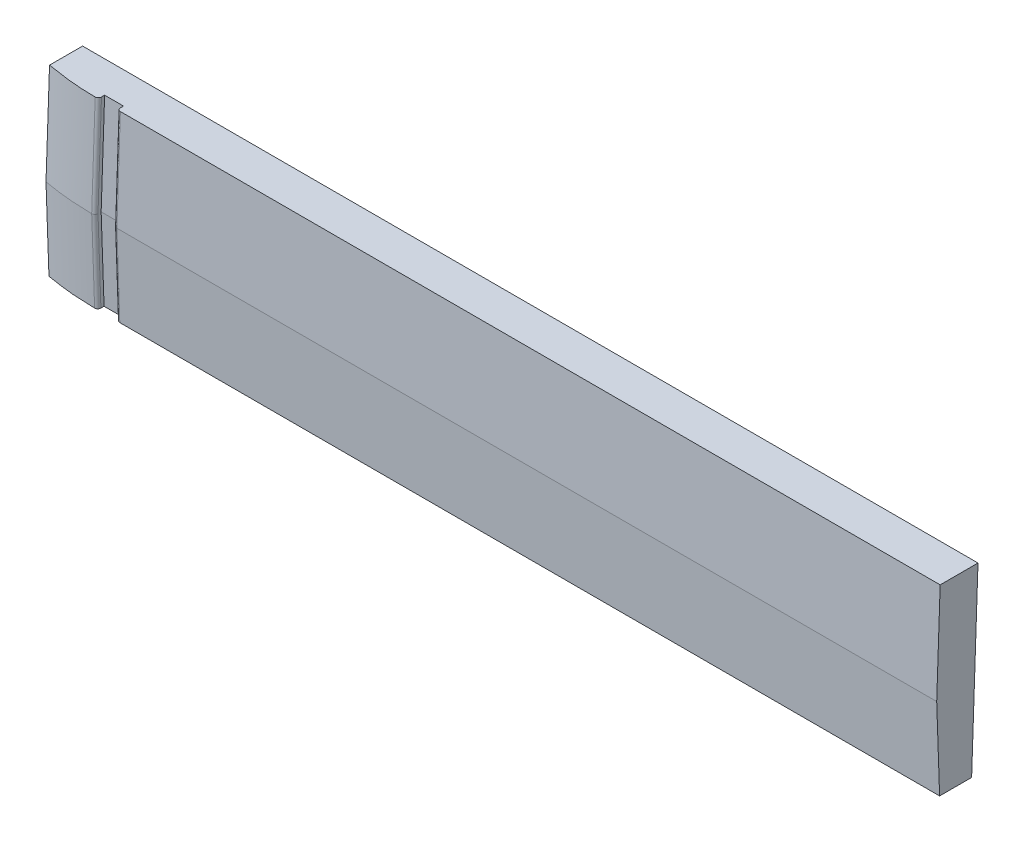
ISO-10303-21;
HEADER;
FILE_DESCRIPTION(('STEP AP214'),'2;1');
FILE_NAME('part.step','',(''),(''),'','','');
FILE_SCHEMA(('AUTOMOTIVE_DESIGN { 1 0 10303 214 1 1 1 1 }'));
ENDSEC;
DATA;
#1=APPLICATION_CONTEXT('core data for automotive mechanical design processes');
#2=APPLICATION_PROTOCOL_DEFINITION('international standard','automotive_design',2000,#1);
#3=PRODUCT_CONTEXT('',#1,'mechanical');
#4=PRODUCT('Part','Part','',(#3));
#5=PRODUCT_RELATED_PRODUCT_CATEGORY('part','',(#4));
#6=PRODUCT_DEFINITION_FORMATION('','',#4);
#7=PRODUCT_DEFINITION_CONTEXT('part definition',#1,'design');
#8=PRODUCT_DEFINITION('design','',#6,#7);
#9=PRODUCT_DEFINITION_SHAPE('','',#8);
#10=(LENGTH_UNIT() NAMED_UNIT(*) SI_UNIT(.MILLI.,.METRE.));
#11=(NAMED_UNIT(*) PLANE_ANGLE_UNIT() SI_UNIT($,.RADIAN.));
#12=(NAMED_UNIT(*) SI_UNIT($,.STERADIAN.) SOLID_ANGLE_UNIT());
#13=UNCERTAINTY_MEASURE_WITH_UNIT(LENGTH_MEASURE(1.E-05),#10,'distance_accuracy_value','');
#14=(GEOMETRIC_REPRESENTATION_CONTEXT(3) GLOBAL_UNCERTAINTY_ASSIGNED_CONTEXT((#13)) GLOBAL_UNIT_ASSIGNED_CONTEXT((#10,
#11,#12)) REPRESENTATION_CONTEXT('',''));
#15=CARTESIAN_POINT('',(0.,0.,0.));
#16=DIRECTION('',(0.,0.,1.));
#17=DIRECTION('',(1.,0.,0.));
#18=AXIS2_PLACEMENT_3D('',#15,#16,#17);
#19=CARTESIAN_POINT('',(-24.5512337359037,-2.09263550424058,77.8644417309036));
#20=DIRECTION('',(0.,-1.,0.));
#21=DIRECTION('',(0.,0.,-1.));
#22=AXIS2_PLACEMENT_3D('',#19,#20,#21);
#23=PLANE('',#22);
#24=DIRECTION('',(0.,0.,-1.));
#25=VECTOR('',#24,1.);
#26=CARTESIAN_POINT('',(11.5425757379215,-2.09263550424058,77.8644417309036));
#27=LINE('',#26,#25);
#28=CARTESIAN_POINT('',(11.5425757379215,-2.09263550424058,76.667518172723));
#29=VERTEX_POINT('',#28);
#30=CARTESIAN_POINT('',(11.5425757379215,-2.09263550424058,75.1425892272116));
#31=VERTEX_POINT('',#30);
#32=EDGE_CURVE('E463',#29,#31,#27,.T.);
#33=ORIENTED_EDGE('',*,*,#32,.T.);
#34=DIRECTION('',(1.,0.,0.));
#35=VECTOR('',#34,1.);
#36=CARTESIAN_POINT('',(-24.5512337359037,-2.09263550424058,75.1425892272116));
#37=LINE('',#36,#35);
#38=CARTESIAN_POINT('',(-24.5512337359037,-2.09263550424058,75.1425892272116));
#39=VERTEX_POINT('',#38);
#40=EDGE_CURVE('E142',#31,#39,#37,.F.);
#41=ORIENTED_EDGE('',*,*,#40,.T.);
#42=DIRECTION('',(0.,0.,-1.));
#43=VECTOR('',#42,1.);
#44=CARTESIAN_POINT('',(-24.5512337359037,-2.09263550424058,77.8644417309036));
#45=LINE('',#44,#43);
#46=CARTESIAN_POINT('',(-24.5512337359037,-2.09263550424057,76.4753093176839));
#47=VERTEX_POINT('',#46);
#48=EDGE_CURVE('E309',#47,#39,#45,.T.);
#49=ORIENTED_EDGE('',*,*,#48,.F.);
#50=CARTESIAN_POINT('',(-24.5512337359037,-2.09263550424057,76.4753093176839));
#51=CARTESIAN_POINT('',(-24.4673252329953,-2.09263550424058,76.4906340997932));
#52=CARTESIAN_POINT('',(-24.3832551491383,-2.09263550424058,76.5050738506485));
#53=CARTESIAN_POINT('',(-24.2149487286211,-2.09263550424058,76.5321592839662));
#54=CARTESIAN_POINT('',(-24.1307127965558,-2.09263550424058,76.5448074805458));
#55=CARTESIAN_POINT('',(-23.9620757726557,-2.09263550424058,76.568317798295));
#56=CARTESIAN_POINT('',(-23.8776749220488,-2.09263550424058,76.5791816495076));
#57=CARTESIAN_POINT('',(-23.7087063127157,-2.09263550424058,76.5991123585587));
#58=CARTESIAN_POINT('',(-23.6241386655582,-2.09263550424058,76.6081801615634));
#59=CARTESIAN_POINT('',(-23.4548178011712,-2.09263550424058,76.6244891717812));
#60=CARTESIAN_POINT('',(-23.3700645648744,-2.09263550424058,76.6317301814837));
#61=CARTESIAN_POINT('',(-23.2003795895393,-2.09263550424058,76.6443216030497));
#62=CARTESIAN_POINT('',(-23.1154477879616,-2.09263550424058,76.6496711742081));
#63=CARTESIAN_POINT('',(-22.9453992336797,-2.09263550424058,76.6583850578061));
#64=CARTESIAN_POINT('',(-22.8602823817639,-2.09263550424058,76.6617474656316));
#65=CARTESIAN_POINT('',(-22.6898567775566,-2.09263550424058,76.666306974217));
#66=CARTESIAN_POINT('',(-22.6045479346215,-2.09263550424057,76.6675006433299));
#67=CARTESIAN_POINT('',(-22.5192337359037,-2.09263550424057,76.667518172723));
#68=B_SPLINE_CURVE_WITH_KNOTS('',3,(#50,#51,#52,#53,#54,#55,#56,#57,#58,#59,#60,#61,#62,#63,#64,
#65,#66,#67),.UNSPECIFIED.,.F.,.F.,(4,2,2,2,2,2,2,2,4),(0.,0.255884533439009,0.511406344853519,
0.766678929215413,1.02181681796092,1.27698228009095,1.53226101579574,1.78778403048738,
2.04371101436006),.UNSPECIFIED.);
#69=CARTESIAN_POINT('',(-22.519233734635,-2.09263550424058,76.667518172723));
#70=VERTEX_POINT('',#69);
#71=EDGE_CURVE('E352',#47,#70,#68,.T.);
#72=ORIENTED_EDGE('',*,*,#71,.T.);
#73=CARTESIAN_POINT('',(-22.5192337359037,-2.09263550424058,76.540440760597));
#74=DIRECTION('',(0.,-1.,0.));
#75=DIRECTION('',(0.,0.,-1.));
#76=AXIS2_PLACEMENT_3D('',#73,#74,#75);
#77=ELLIPSE('',#76,0.12707741212595,0.127);
#78=CARTESIAN_POINT('',(-22.3922337359037,-2.09263550424058,76.540440760597));
#79=VERTEX_POINT('',#78);
#80=EDGE_CURVE('E56',#70,#79,#77,.F.);
#81=ORIENTED_EDGE('',*,*,#80,.T.);
#82=DIRECTION('',(0.,0.,-1.));
#83=VECTOR('',#82,1.);
#84=CARTESIAN_POINT('',(-22.3922337359037,-2.09263550424058,77.2670760467615));
#85=LINE('',#84,#83);
#86=CARTESIAN_POINT('',(-22.3922337359037,-2.09263550424057,76.4133633484711));
#87=VERTEX_POINT('',#86);
#88=EDGE_CURVE('E416',#79,#87,#85,.T.);
#89=ORIENTED_EDGE('',*,*,#88,.T.);
#90=DIRECTION('',(1.,0.,0.));
#91=VECTOR('',#90,1.);
#92=CARTESIAN_POINT('',(-22.5192337359037,-2.09263550424058,76.4133633484711));
#93=LINE('',#92,#91);
#94=CARTESIAN_POINT('',(-21.6302337359037,-2.09263550424058,76.4133633484711));
#95=VERTEX_POINT('',#94);
#96=EDGE_CURVE('E394',#87,#95,#93,.T.);
#97=ORIENTED_EDGE('',*,*,#96,.T.);
#98=DIRECTION('',(0.,0.,1.));
#99=VECTOR('',#98,1.);
#100=CARTESIAN_POINT('',(-21.6302337359037,-2.09263550424058,76.2648902542857));
#101=LINE('',#100,#99);
#102=CARTESIAN_POINT('',(-21.6302337359037,-2.09263550424058,76.540440760597));
#103=VERTEX_POINT('',#102);
#104=EDGE_CURVE('E384',#95,#103,#101,.T.);
#105=ORIENTED_EDGE('',*,*,#104,.T.);
#106=CARTESIAN_POINT('',(-21.5032337359037,-2.09263550424058,76.540440760597));
#107=DIRECTION('',(0.,-1.,0.));
#108=DIRECTION('',(0.,0.,1.));
#109=AXIS2_PLACEMENT_3D('',#106,#107,#108);
#110=ELLIPSE('',#109,0.12707741212595,0.127);
#111=CARTESIAN_POINT('',(-21.5032337359037,-2.09263550424058,76.667518172723));
#112=VERTEX_POINT('',#111);
#113=EDGE_CURVE('E392',#103,#112,#110,.F.);
#114=ORIENTED_EDGE('',*,*,#113,.T.);
#115=DIRECTION('',(1.,0.,0.));
#116=VECTOR('',#115,1.);
#117=CARTESIAN_POINT('',(-22.5192337359037,-2.09263550424058,76.667518172723));
#118=LINE('',#117,#116);
#119=EDGE_CURVE('E396',#112,#29,#118,.T.);
#120=ORIENTED_EDGE('',*,*,#119,.T.);
#121=EDGE_LOOP('',(#33,#41,#49,#72,#81,#89,#97,#105,#114,#120));
#122=FACE_BOUND('',#121,.T.);
#123=ADVANCED_FACE('F120',(#122),#23,.F.);
#124=CARTESIAN_POINT('',(11.5425757379215,-2.09263550424058,77.8644417309036));
#125=DIRECTION('',(-1.,0.,0.));
#126=DIRECTION('',(0.,-1.,0.));
#127=AXIS2_PLACEMENT_3D('',#124,#125,#126);
#128=PLANE('',#127);
#129=DIRECTION('',(0.,0.,-1.));
#130=VECTOR('',#129,1.);
#131=CARTESIAN_POINT('',(11.5425757379215,-9.45118683297461,77.8644417309036));
#132=LINE('',#131,#130);
#133=CARTESIAN_POINT('',(11.5425757379215,-9.45118683297461,76.6901530354748));
#134=VERTEX_POINT('',#133);
#135=CARTESIAN_POINT('',(11.5425757379215,-9.45118683297461,75.3995555019555));
#136=VERTEX_POINT('',#135);
#137=EDGE_CURVE('E460',#134,#136,#132,.T.);
#138=ORIENTED_EDGE('',*,*,#137,.T.);
#139=DIRECTION('',(0.,0.999390827019096,-0.0348994967025011));
#140=VECTOR('',#139,1.);
#141=CARTESIAN_POINT('',(11.5425757379215,0.,75.0695127851378));
#142=LINE('',#141,#140);
#143=EDGE_CURVE('E135',#31,#136,#142,.F.);
#144=ORIENTED_EDGE('',*,*,#143,.F.);
#145=ORIENTED_EDGE('',*,*,#32,.F.);
#146=DIRECTION('',(0.,-0.999390827019096,0.034899496702501));
#147=VECTOR('',#146,1.);
#148=CARTESIAN_POINT('',(11.5425757379215,0.,76.5944417306492));
#149=LINE('',#148,#147);
#150=CARTESIAN_POINT('',(11.5425757379215,-6.096,76.8073187414708));
#151=VERTEX_POINT('',#150);
#152=EDGE_CURVE('E419',#29,#151,#149,.T.);
#153=ORIENTED_EDGE('',*,*,#152,.T.);
#154=DIRECTION('',(0.,-0.999390827019096,-0.034899496702501));
#155=VECTOR('',#154,1.);
#156=CARTESIAN_POINT('',(11.5425757379215,-6.096,76.8073187414708));
#157=LINE('',#156,#155);
#158=EDGE_CURVE('E421',#151,#134,#157,.T.);
#159=ORIENTED_EDGE('',*,*,#158,.T.);
#160=EDGE_LOOP('',(#138,#144,#145,#153,#159));
#161=FACE_BOUND('',#160,.T.);
#162=ADVANCED_FACE('F316',(#161),#128,.F.);
#163=CARTESIAN_POINT('',(-24.5512337359037,-2.09263550424058,77.8644417309036));
#164=DIRECTION('',(1.,0.,0.));
#165=DIRECTION('',(0.,0.,-1.));
#166=AXIS2_PLACEMENT_3D('',#163,#164,#165);
#167=PLANE('',#166);
#168=ORIENTED_EDGE('',*,*,#48,.T.);
#169=DIRECTION('',(0.,0.999390827019096,-0.0348994967025011));
#170=VECTOR('',#169,1.);
#171=CARTESIAN_POINT('',(-24.5512337359037,-2.18756892059516,75.1459043751612));
#172=LINE('',#171,#170);
#173=CARTESIAN_POINT('',(-24.5512337359037,-9.45118683297461,75.3995555019555));
#174=VERTEX_POINT('',#173);
#175=EDGE_CURVE('E465',#39,#174,#172,.F.);
#176=ORIENTED_EDGE('',*,*,#175,.T.);
#177=DIRECTION('',(0.,0.,-1.));
#178=VECTOR('',#177,1.);
#179=CARTESIAN_POINT('',(-24.5512337359037,-9.45118683297461,77.8644417309036));
#180=LINE('',#179,#178);
#181=CARTESIAN_POINT('',(-24.5512337359037,-9.45118683297461,76.4983295331985));
#182=VERTEX_POINT('',#181);
#183=EDGE_CURVE('E245',#182,#174,#180,.T.);
#184=ORIENTED_EDGE('',*,*,#183,.F.);
#185=CARTESIAN_POINT('',(-24.5512337359037,-9.45118683297461,76.4983295331985));
#186=CARTESIAN_POINT('',(-24.5512337359037,-8.89198913338889,76.5181816507761));
#187=CARTESIAN_POINT('',(-24.5512337359037,-8.33279138085734,76.5380322767425));
#188=CARTESIAN_POINT('',(-24.5512337359037,-7.21439576988659,76.5777305454536));
#189=CARTESIAN_POINT('',(-24.5512337359037,-6.65519791144739,76.5975781881983));
#190=CARTESIAN_POINT('',(-24.5512337359037,-6.09600000006236,76.6174243393319));
#191=B_SPLINE_CURVE_WITH_KNOTS('',3,(#185,#186,#187,#188,#189,#190),.UNSPECIFIED.,.F.,.F.,(4,2,
4),(0.,1.67864992302992,3.35729984610787),.UNSPECIFIED.);
#192=CARTESIAN_POINT('',(-24.5512314817154,-6.096,76.6174118457366));
#193=VERTEX_POINT('',#192);
#194=EDGE_CURVE('E240',#182,#193,#191,.T.);
#195=ORIENTED_EDGE('',*,*,#194,.T.);
#196=CARTESIAN_POINT('',(-24.5512337350748,-6.09600000000001,76.6173985386492));
#197=CARTESIAN_POINT('',(-24.5512337353511,-4.7615451680802,76.5700354649941));
#198=CARTESIAN_POINT('',(-24.5512337356274,-3.42709033616038,76.522672391339));
#199=CARTESIAN_POINT('',(-24.5512337359037,-2.09263550424057,76.4753093176839));
#200=B_SPLINE_CURVE_WITH_KNOTS('',3,(#196,#197,#198,#199),.UNSPECIFIED.,.F.,.F.,(4,4),(0.,
4.00588524955743),.UNSPECIFIED.);
#201=EDGE_CURVE('E329',#193,#47,#200,.T.);
#202=ORIENTED_EDGE('',*,*,#201,.T.);
#203=EDGE_LOOP('',(#168,#176,#184,#195,#202));
#204=FACE_BOUND('',#203,.T.);
#205=ADVANCED_FACE('F315',(#204),#167,.F.);
#206=CARTESIAN_POINT('',(-24.5512337359037,-9.45118683297461,77.8644417309036));
#207=DIRECTION('',(0.,1.,0.));
#208=DIRECTION('',(0.,0.,1.));
#209=AXIS2_PLACEMENT_3D('',#206,#207,#208);
#210=PLANE('',#209);
#211=ORIENTED_EDGE('',*,*,#183,.T.);
#212=DIRECTION('',(-1.,0.,0.));
#213=VECTOR('',#212,1.);
#214=CARTESIAN_POINT('',(-24.5512337359037,-9.45118683297461,75.3995555019555));
#215=LINE('',#214,#213);
#216=EDGE_CURVE('E466',#174,#136,#215,.F.);
#217=ORIENTED_EDGE('',*,*,#216,.T.);
#218=ORIENTED_EDGE('',*,*,#137,.F.);
#219=DIRECTION('',(-1.,0.,0.));
#220=VECTOR('',#219,1.);
#221=CARTESIAN_POINT('',(22.5192337359037,-9.45118683297461,76.6901530354748));
#222=LINE('',#221,#220);
#223=CARTESIAN_POINT('',(-21.5032337359037,-9.45118683297461,76.6901530354748));
#224=VERTEX_POINT('',#223);
#225=EDGE_CURVE('E431',#134,#224,#222,.T.);
#226=ORIENTED_EDGE('',*,*,#225,.T.);
#227=CARTESIAN_POINT('',(-21.5032337359037,-9.45118683297461,76.5630756233488));
#228=DIRECTION('',(0.,1.,0.));
#229=DIRECTION('',(0.,0.,1.));
#230=AXIS2_PLACEMENT_3D('',#227,#228,#229);
#231=ELLIPSE('',#230,0.12707741212595,0.127);
#232=CARTESIAN_POINT('',(-21.6302337359037,-9.45118683297461,76.5630756233488));
#233=VERTEX_POINT('',#232);
#234=EDGE_CURVE('E433',#224,#233,#231,.F.);
#235=ORIENTED_EDGE('',*,*,#234,.T.);
#236=DIRECTION('',(0.,0.,-1.));
#237=VECTOR('',#236,1.);
#238=CARTESIAN_POINT('',(-21.6302337359037,-9.45118683297461,76.2648902542857));
#239=LINE('',#238,#237);
#240=CARTESIAN_POINT('',(-21.6302337359037,-9.45118683297461,76.4359982117319));
#241=VERTEX_POINT('',#240);
#242=EDGE_CURVE('E438',#233,#241,#239,.T.);
#243=ORIENTED_EDGE('',*,*,#242,.T.);
#244=DIRECTION('',(-1.,0.,0.));
#245=VECTOR('',#244,1.);
#246=CARTESIAN_POINT('',(-22.5192337359037,-9.45118683297461,76.4359982117319));
#247=LINE('',#246,#245);
#248=CARTESIAN_POINT('',(-22.3922337359037,-9.45118683297461,76.4359982117319));
#249=VERTEX_POINT('',#248);
#250=EDGE_CURVE('E440',#241,#249,#247,.T.);
#251=ORIENTED_EDGE('',*,*,#250,.T.);
#252=DIRECTION('',(0.,0.,1.));
#253=VECTOR('',#252,1.);
#254=CARTESIAN_POINT('',(-22.3922337359037,-9.45118683297461,77.2670760467615));
#255=LINE('',#254,#253);
#256=CARTESIAN_POINT('',(-22.3922337359037,-9.45118683297461,76.5630756233488));
#257=VERTEX_POINT('',#256);
#258=EDGE_CURVE('E244',#249,#257,#255,.T.);
#259=ORIENTED_EDGE('',*,*,#258,.T.);
#260=CARTESIAN_POINT('',(-22.5192337359037,-9.45118683297461,76.5630756233488));
#261=DIRECTION('',(0.,1.,0.));
#262=DIRECTION('',(0.,0.,-1.));
#263=AXIS2_PLACEMENT_3D('',#260,#261,#262);
#264=ELLIPSE('',#263,0.12707741212595,0.127);
#265=CARTESIAN_POINT('',(-22.5192337397248,-9.45118683297461,76.6901530354748));
#266=VERTEX_POINT('',#265);
#267=EDGE_CURVE('E128',#257,#266,#264,.F.);
#268=ORIENTED_EDGE('',*,*,#267,.T.);
#269=CARTESIAN_POINT('',(-22.5192337378274,-9.45118683297461,76.6901530354748));
#270=CARTESIAN_POINT('',(-22.604545600344,-9.45118683297461,76.6901357845135));
#271=CARTESIAN_POINT('',(-22.6898522074064,-9.45118683297461,76.6889469796243));
#272=CARTESIAN_POINT('',(-22.8602741534909,-9.45118683297461,76.6844035922124));
#273=CARTESIAN_POINT('',(-22.9453895822859,-9.45118683297461,76.6810524198236));
#274=CARTESIAN_POINT('',(-23.1154359788727,-9.45118683297461,76.672364622054));
#275=CARTESIAN_POINT('',(-23.2003670451761,-9.45118683297461,76.6670298938971));
#276=CARTESIAN_POINT('',(-23.3700511259969,-9.45118683297461,76.6544702893802));
#277=CARTESIAN_POINT('',(-23.4548042027324,-9.45118683297461,76.6472462515609));
#278=CARTESIAN_POINT('',(-23.6241252908058,-9.45118683297461,76.6309719120872));
#279=CARTESIAN_POINT('',(-23.7086933209722,-9.45118683297461,76.6219218058902));
#280=CARTESIAN_POINT('',(-23.8776630718664,-9.45118683297461,76.6020275253804));
#281=CARTESIAN_POINT('',(-23.9620646816013,-9.45118683297461,76.5911824090803));
#282=CARTESIAN_POINT('',(-24.1307037441689,-9.45118683297461,76.5677117201046));
#283=CARTESIAN_POINT('',(-24.2149409569977,-9.45118683297461,76.5550844233109));
#284=CARTESIAN_POINT('',(-24.383250612094,-9.45118683297461,76.5280439361646));
#285=CARTESIAN_POINT('',(-24.4673226521766,-9.45118683297461,76.5136282424378));
#286=CARTESIAN_POINT('',(-24.5512337359037,-9.45118683297461,76.4983295331985));
#287=B_SPLINE_CURVE_WITH_KNOTS('',3,(#269,#270,#271,#272,#273,#274,#275,#276,#277,#278,#279,
#280,#281,#282,#283,#284,#285,#286),.UNSPECIFIED.,.F.,.F.,(4,2,2,2,2,2,2,2,4),(0.,
0.255920177459859,0.511437742435283,0.766711536988046,1.02187222394193,1.27700561365397,
1.53227331953731,1.78778969130847,2.04366785490871),.UNSPECIFIED.);
#288=EDGE_CURVE('E237',#266,#182,#287,.T.);
#289=ORIENTED_EDGE('',*,*,#288,.T.);
#290=EDGE_LOOP('',(#211,#217,#218,#226,#235,#243,#251,#259,#268,#289));
#291=FACE_BOUND('',#290,.T.);
#292=ADVANCED_FACE('F248',(#291),#210,.F.);
#293=CARTESIAN_POINT('',(-22.5192337359037,-6.09156776390103,76.68039610644));
#294=DIRECTION('',(0.,-0.999390827019096,-0.034899496702501));
#295=DIRECTION('',(0.,0.034899496702501,-0.999390827019096));
#296=AXIS2_PLACEMENT_3D('',#293,#294,#295);
#297=CYLINDRICAL_SURFACE('',#296,0.127);
#298=ORIENTED_EDGE('',*,*,#267,.F.);
#299=DIRECTION('',(0.,-0.999390827019096,-0.034899496702501));
#300=VECTOR('',#299,1.);
#301=CARTESIAN_POINT('',(-22.3922337359037,-6.09156776390103,76.68039610644));
#302=LINE('',#301,#300);
#303=CARTESIAN_POINT('',(-22.3922337359037,-6.096,76.6802413293449));
#304=VERTEX_POINT('',#303);
#305=EDGE_CURVE('E260',#304,#257,#302,.T.);
#306=ORIENTED_EDGE('',*,*,#305,.F.);
#307=CARTESIAN_POINT('',(-22.5192337359037,-6.096,76.6802413293449));
#308=DIRECTION('',(0.,1.,0.));
#309=DIRECTION('',(0.,0.,-1.));
#310=AXIS2_PLACEMENT_3D('',#307,#308,#309);
#311=ELLIPSE('',#310,0.12707741212595,0.127);
#312=CARTESIAN_POINT('',(-22.5192337359037,-6.096,76.8073187414708));
#313=VERTEX_POINT('',#312);
#314=EDGE_CURVE('E229',#313,#304,#311,.T.);
#315=ORIENTED_EDGE('',*,*,#314,.F.);
#316=DIRECTION('',(1.13817022447336E-09,0.999390827019096,0.0348994967025004));
#317=VECTOR('',#316,1.);
#318=CARTESIAN_POINT('',(-22.5192337359037,-6.096,76.8073187414708));
#319=LINE('',#318,#317);
#320=EDGE_CURVE('E222',#266,#313,#319,.T.);
#321=ORIENTED_EDGE('',*,*,#320,.F.);
#322=EDGE_LOOP('',(#298,#306,#315,#321));
#323=FACE_BOUND('',#322,.T.);
#324=ADVANCED_FACE('F224',(#323),#297,.T.);
#325=CARTESIAN_POINT('',(-31.7088770108217,-6.096,68.4673388474983));
#326=CARTESIAN_POINT('',(-31.7088770037362,-6.096,70.2294225525166));
#327=CARTESIAN_POINT('',(-31.30627653682,-6.096,71.6434388808505));
#328=CARTESIAN_POINT('',(-30.0019064857797,-6.096,73.8844938125865));
#329=CARTESIAN_POINT('',(-29.1025842805947,-6.096,74.7093783390235));
#330=CARTESIAN_POINT('',(-27.1438610514689,-6.096,75.9062493582435));
#331=CARTESIAN_POINT('',(-26.0842653021754,-6.096,76.2800649819833));
#332=CARTESIAN_POINT('',(-24.1147517216478,-6.096,76.7305884669515));
#333=CARTESIAN_POINT('',(-23.204621898477,-6.096,76.8073187638233));
#334=CARTESIAN_POINT('',(-22.5192337359037,-6.096,76.8073187414708));
#335=CARTESIAN_POINT('',(-31.496,-12.192,68.467338847067));
#336=CARTESIAN_POINT('',(-31.4959999927601,-12.192,70.1974868593166));
#337=CARTESIAN_POINT('',(-31.1023590820459,-12.192,71.5706050178433));
#338=CARTESIAN_POINT('',(-29.8378586795655,-12.192,73.7431593921078));
#339=CARTESIAN_POINT('',(-28.9668935501693,-12.192,74.542818554765));
#340=CARTESIAN_POINT('',(-27.0575594371575,-12.192,75.7095105245253));
#341=CARTESIAN_POINT('',(-26.0192020353932,-12.192,76.0765726207032));
#342=CARTESIAN_POINT('',(-24.0848765517284,-12.192,76.5190468775936));
#343=CARTESIAN_POINT('',(-23.1889903300286,-12.192,76.5944417530784));
#344=CARTESIAN_POINT('',(-22.5192337393988,-12.192,76.5944417306492));
#345=B_SPLINE_SURFACE_WITH_KNOTS('',1,3,((#325,#326,#327,#328,#329,#330,#331,#332,#333,#334),
(#335,#336,#337,#338,#339,#340,#341,#342,#343,#344)),.UNSPECIFIED.,.F.,.F.,.F.,(2,2),(4,2,2,2,
4),(0.,1.),(0.,0.25,0.5,0.75,1.),.UNSPECIFIED.);
#346=CARTESIAN_POINT('',(-22.5192337359037,-6.096,76.8073187414708));
#347=CARTESIAN_POINT('',(-23.204621898477,-6.096,76.8073187638233));
#348=CARTESIAN_POINT('',(-24.1147517216478,-6.096,76.7305884669515));
#349=CARTESIAN_POINT('',(-26.0842653021754,-6.096,76.2800649819833));
#350=CARTESIAN_POINT('',(-27.1438610514689,-6.096,75.9062493582435));
#351=CARTESIAN_POINT('',(-29.1025842805947,-6.096,74.7093783390235));
#352=CARTESIAN_POINT('',(-30.0019064857797,-6.096,73.8844938125865));
#353=CARTESIAN_POINT('',(-31.30627653682,-6.096,71.6434388808505));
#354=CARTESIAN_POINT('',(-31.7088770037362,-6.096,70.2294225525166));
#355=CARTESIAN_POINT('',(-31.7088770108217,-6.096,68.4673388474983));
#356=B_SPLINE_CURVE_WITH_KNOTS('',3,(#346,#347,#348,#349,#350,#351,#352,#353,#354,#355),
.UNSPECIFIED.,.F.,.F.,(4,2,2,2,4),(0.,0.25,0.5,0.75,1.),.UNSPECIFIED.);
#357=EDGE_CURVE('E267',#313,#193,#356,.T.);
#358=ORIENTED_EDGE('',*,*,#194,.F.);
#359=ORIENTED_EDGE('',*,*,#288,.F.);
#360=ORIENTED_EDGE('',*,*,#320,.T.);
#361=ORIENTED_EDGE('',*,*,#357,.T.);
#362=EDGE_LOOP('',(#358,#359,#360,#361));
#363=FACE_BOUND('',#362,.T.);
#364=ADVANCED_FACE('F238',(#363),#345,.T.);
#365=CARTESIAN_POINT('',(-22.5192337359037,-0.00443223608121763,76.4675190956177));
#366=DIRECTION('',(0.,0.999390827019096,-0.034899496702501));
#367=DIRECTION('',(0.,0.034899496702501,0.999390827019096));
#368=AXIS2_PLACEMENT_3D('',#365,#366,#367);
#369=CYLINDRICAL_SURFACE('',#368,0.127);
#370=ORIENTED_EDGE('',*,*,#80,.F.);
#371=DIRECTION('',(6.05893785531317E-10,-0.999390827019096,0.034899496702501));
#372=VECTOR('',#371,1.);
#373=CARTESIAN_POINT('',(-22.5192337359037,0.,76.5944417306492));
#374=LINE('',#373,#372);
#375=EDGE_CURVE('E362',#313,#70,#374,.F.);
#376=ORIENTED_EDGE('',*,*,#375,.F.);
#377=ORIENTED_EDGE('',*,*,#314,.T.);
#378=DIRECTION('',(0.,0.999390827019096,-0.034899496702501));
#379=VECTOR('',#378,1.);
#380=CARTESIAN_POINT('',(-22.3922337359037,-6.11646776027881,76.6809560792836));
#381=LINE('',#380,#379);
#382=EDGE_CURVE('E250',#79,#304,#381,.F.);
#383=ORIENTED_EDGE('',*,*,#382,.F.);
#384=EDGE_LOOP('',(#370,#376,#377,#383));
#385=FACE_BOUND('',#384,.T.);
#386=ADVANCED_FACE('F122',(#385),#369,.T.);
#387=CARTESIAN_POINT('',(-22.5192337359037,-6.08713552783756,76.553473471917));
#388=DIRECTION('',(0.,-0.034899496702501,0.999390827019096));
#389=DIRECTION('',(0.,0.999390827019096,0.034899496702501));
#390=AXIS2_PLACEMENT_3D('',#387,#388,#389);
#391=PLANE('',#390);
#392=ORIENTED_EDGE('',*,*,#250,.F.);
#393=DIRECTION('',(0.,0.999390827019096,0.034899496702501));
#394=VECTOR('',#393,1.);
#395=CARTESIAN_POINT('',(-21.6302337359037,-6.08713552783756,76.553473471917));
#396=LINE('',#395,#394);
#397=CARTESIAN_POINT('',(-21.6302337359037,-6.096,76.5531639172189));
#398=VERTEX_POINT('',#397);
#399=EDGE_CURVE('E403',#241,#398,#396,.T.);
#400=ORIENTED_EDGE('',*,*,#399,.T.);
#401=DIRECTION('',(1.,0.,0.));
#402=VECTOR('',#401,1.);
#403=CARTESIAN_POINT('',(28.1232226660318,-6.096,76.5531639177279));
#404=LINE('',#403,#402);
#405=CARTESIAN_POINT('',(-22.3922337359037,-6.096,76.5531639172189));
#406=VERTEX_POINT('',#405);
#407=EDGE_CURVE('E233',#406,#398,#404,.T.);
#408=ORIENTED_EDGE('',*,*,#407,.F.);
#409=DIRECTION('',(0.,0.999390827019096,0.034899496702501));
#410=VECTOR('',#409,1.);
#411=CARTESIAN_POINT('',(-22.3922337359037,-6.08713552783756,76.553473471917));
#412=LINE('',#411,#410);
#413=EDGE_CURVE('E400',#249,#406,#412,.T.);
#414=ORIENTED_EDGE('',*,*,#413,.F.);
#415=EDGE_LOOP('',(#392,#400,#408,#414));
#416=FACE_BOUND('',#415,.T.);
#417=ADVANCED_FACE('F285',(#416),#391,.T.);
#418=CARTESIAN_POINT('',(-22.5192337359037,-0.00886447216243526,76.3405964605863));
#419=DIRECTION('',(0.,0.034899496702501,0.999390827019096));
#420=DIRECTION('',(0.,-0.999390827019096,0.034899496702501));
#421=AXIS2_PLACEMENT_3D('',#418,#419,#420);
#422=PLANE('',#421);
#423=ORIENTED_EDGE('',*,*,#96,.F.);
#424=DIRECTION('',(0.,-0.999390827019096,0.034899496702501));
#425=VECTOR('',#424,1.);
#426=CARTESIAN_POINT('',(-22.3922337359037,-6.12089999636003,76.5540334442522));
#427=LINE('',#426,#425);
#428=EDGE_CURVE('E272',#87,#406,#427,.T.);
#429=ORIENTED_EDGE('',*,*,#428,.T.);
#430=ORIENTED_EDGE('',*,*,#407,.T.);
#431=DIRECTION('',(0.,0.999390827019096,-0.034899496702501));
#432=VECTOR('',#431,1.);
#433=CARTESIAN_POINT('',(-21.6302337359037,-6.08594552290024,76.5528128071418));
#434=LINE('',#433,#432);
#435=EDGE_CURVE('E369',#398,#95,#434,.T.);
#436=ORIENTED_EDGE('',*,*,#435,.T.);
#437=EDGE_LOOP('',(#423,#429,#430,#436));
#438=FACE_BOUND('',#437,.T.);
#439=ADVANCED_FACE('F444',(#438),#422,.T.);
#440=CARTESIAN_POINT('',(-22.3922337359037,-6.096,77.2670760467615));
#441=DIRECTION('',(1.,0.,0.));
#442=DIRECTION('',(0.,0.,-1.));
#443=AXIS2_PLACEMENT_3D('',#440,#441,#442);
#444=PLANE('',#443);
#445=ORIENTED_EDGE('',*,*,#258,.F.);
#446=ORIENTED_EDGE('',*,*,#413,.T.);
#447=ORIENTED_EDGE('',*,*,#428,.F.);
#448=ORIENTED_EDGE('',*,*,#88,.F.);
#449=ORIENTED_EDGE('',*,*,#382,.T.);
#450=ORIENTED_EDGE('',*,*,#305,.T.);
#451=EDGE_LOOP('',(#445,#446,#447,#448,#449,#450));
#452=FACE_BOUND('',#451,.T.);
#453=ADVANCED_FACE('F341',(#452),#444,.T.);
#454=CARTESIAN_POINT('',(-21.5032337359037,-6.09156776391878,76.6803961064394));
#455=DIRECTION('',(0.,0.999390827019096,0.034899496702501));
#456=DIRECTION('',(0.,-0.034899496702501,0.999390827019096));
#457=AXIS2_PLACEMENT_3D('',#454,#455,#456);
#458=CYLINDRICAL_SURFACE('',#457,0.127);
#459=ORIENTED_EDGE('',*,*,#234,.F.);
#460=DIRECTION('',(0.,-0.999390827019096,-0.034899496702501));
#461=VECTOR('',#460,1.);
#462=CARTESIAN_POINT('',(-21.5032337359037,-9.70518683297461,76.6812831600239));
#463=LINE('',#462,#461);
#464=CARTESIAN_POINT('',(-21.5032337359037,-6.096,76.8073187414708));
#465=VERTEX_POINT('',#464);
#466=EDGE_CURVE('E410',#465,#224,#463,.T.);
#467=ORIENTED_EDGE('',*,*,#466,.F.);
#468=CARTESIAN_POINT('',(-21.5032337359037,-6.096,76.6802413293449));
#469=DIRECTION('',(0.,1.,0.));
#470=DIRECTION('',(0.,0.,1.));
#471=AXIS2_PLACEMENT_3D('',#468,#469,#470);
#472=ELLIPSE('',#471,0.12707741212595,0.127);
#473=CARTESIAN_POINT('',(-21.6302337359037,-6.096,76.6802413293449));
#474=VERTEX_POINT('',#473);
#475=EDGE_CURVE('E263',#474,#465,#472,.T.);
#476=ORIENTED_EDGE('',*,*,#475,.F.);
#477=DIRECTION('',(0.,-0.999390827019096,-0.034899496702501));
#478=VECTOR('',#477,1.);
#479=CARTESIAN_POINT('',(-21.6302337359037,-6.09156776390103,76.68039610644));
#480=LINE('',#479,#478);
#481=EDGE_CURVE('E386',#233,#474,#480,.F.);
#482=ORIENTED_EDGE('',*,*,#481,.F.);
#483=EDGE_LOOP('',(#459,#467,#476,#482));
#484=FACE_BOUND('',#483,.T.);
#485=ADVANCED_FACE('F451',(#484),#458,.T.);
#486=CARTESIAN_POINT('',(22.5192337359037,-6.096,76.8073187414708));
#487=DIRECTION('',(0.,-0.034899496702501,0.999390827019096));
#488=DIRECTION('',(0.,-0.999390827019096,-0.034899496702501));
#489=AXIS2_PLACEMENT_3D('',#486,#487,#488);
#490=PLANE('',#489);
#491=ORIENTED_EDGE('',*,*,#225,.F.);
#492=ORIENTED_EDGE('',*,*,#158,.F.);
#493=DIRECTION('',(1.,0.,0.));
#494=VECTOR('',#493,1.);
#495=CARTESIAN_POINT('',(22.5192337359037,-6.096,76.8073187414708));
#496=LINE('',#495,#494);
#497=EDGE_CURVE('E234',#465,#151,#496,.T.);
#498=ORIENTED_EDGE('',*,*,#497,.F.);
#499=ORIENTED_EDGE('',*,*,#466,.T.);
#500=EDGE_LOOP('',(#491,#492,#498,#499));
#501=FACE_BOUND('',#500,.T.);
#502=ADVANCED_FACE('F287',(#501),#490,.T.);
#503=CARTESIAN_POINT('',(-21.5032337359037,-0.00443223608121727,76.4675190956177));
#504=DIRECTION('',(0.,-0.999390827019096,0.034899496702501));
#505=DIRECTION('',(0.,-0.034899496702501,-0.999390827019096));
#506=AXIS2_PLACEMENT_3D('',#503,#504,#505);
#507=CYLINDRICAL_SURFACE('',#506,0.127);
#508=ORIENTED_EDGE('',*,*,#113,.F.);
#509=DIRECTION('',(0.,-0.999390827019096,0.034899496702501));
#510=VECTOR('',#509,1.);
#511=CARTESIAN_POINT('',(-21.6302337359037,-6.08151328681902,76.6797354421732));
#512=LINE('',#511,#510);
#513=EDGE_CURVE('E251',#474,#103,#512,.F.);
#514=ORIENTED_EDGE('',*,*,#513,.F.);
#515=ORIENTED_EDGE('',*,*,#475,.T.);
#516=DIRECTION('',(0.,-0.999390827019096,0.034899496702501));
#517=VECTOR('',#516,1.);
#518=CARTESIAN_POINT('',(-21.5032337359037,0.,76.5944417306492));
#519=LINE('',#518,#517);
#520=EDGE_CURVE('E372',#112,#465,#519,.T.);
#521=ORIENTED_EDGE('',*,*,#520,.F.);
#522=EDGE_LOOP('',(#508,#514,#515,#521));
#523=FACE_BOUND('',#522,.T.);
#524=ADVANCED_FACE('F476',(#523),#507,.T.);
#525=CARTESIAN_POINT('',(-21.6302337359037,-6.096,76.2648902542857));
#526=DIRECTION('',(-1.,0.,0.));
#527=DIRECTION('',(0.,0.,1.));
#528=AXIS2_PLACEMENT_3D('',#525,#526,#527);
#529=PLANE('',#528);
#530=ORIENTED_EDGE('',*,*,#242,.F.);
#531=ORIENTED_EDGE('',*,*,#481,.T.);
#532=ORIENTED_EDGE('',*,*,#513,.T.);
#533=ORIENTED_EDGE('',*,*,#104,.F.);
#534=ORIENTED_EDGE('',*,*,#435,.F.);
#535=ORIENTED_EDGE('',*,*,#399,.F.);
#536=EDGE_LOOP('',(#530,#531,#532,#533,#534,#535));
#537=FACE_BOUND('',#536,.T.);
#538=ADVANCED_FACE('F339',(#537),#529,.T.);
#539=CARTESIAN_POINT('',(-37.1274294105739,-161.263038946053,68.4673388474983));
#540=CARTESIAN_POINT('',(-37.1274294117883,-161.263038946053,69.7583074748163));
#541=CARTESIAN_POINT('',(-36.9789683113336,-161.263038946053,71.0116005055926));
#542=CARTESIAN_POINT('',(-36.3744752087449,-161.263038946053,73.380414039088));
#543=CARTESIAN_POINT('',(-35.9166160055396,-161.263038946053,74.4941211157239));
#544=CARTESIAN_POINT('',(-34.7577218529077,-161.263038946053,76.4852319455043));
#545=CARTESIAN_POINT('',(-34.0595918912834,-161.263038946053,77.3598619311012));
#546=CARTESIAN_POINT('',(-32.5559098286348,-161.263038946053,78.8364734139799));
#547=CARTESIAN_POINT('',(-31.7525556452807,-161.263038946053,79.4401894283013));
#548=CARTESIAN_POINT('',(-30.1444629454812,-161.263038946053,80.4228088294831));
#549=CARTESIAN_POINT('',(-29.3391672334057,-161.263038946053,80.8033882249307));
#550=CARTESIAN_POINT('',(-27.7794373602097,-161.263038946053,81.4035982281299));
#551=CARTESIAN_POINT('',(-27.0242700337167,-161.263038946053,81.6235504802007));
#552=CARTESIAN_POINT('',(-25.5913014276474,-161.263038946053,81.9513400488948));
#553=CARTESIAN_POINT('',(-24.9134713620713,-161.263038946053,82.0590947106956));
#554=CARTESIAN_POINT('',(-23.6496798535614,-161.263038946053,82.1962211529804));
#555=CARTESIAN_POINT('',(-23.0643279302706,-161.263038946053,82.225871142139));
#556=CARTESIAN_POINT('',(-22.5192337359037,-161.263038946053,82.225871141223));
#557=CARTESIAN_POINT('',(-31.496,0.,68.4673388474983));
#558=CARTESIAN_POINT('',(-31.4959999980971,0.,69.3324302646878));
#559=CARTESIAN_POINT('',(-31.3975967601624,0.,70.1082348086671));
#560=CARTESIAN_POINT('',(-31.0427207447939,0.,71.498879485885));
#561=CARTESIAN_POINT('',(-30.7862479618678,0.,72.1137196152976));
#562=CARTESIAN_POINT('',(-30.1539698004089,0.,73.2000447935103));
#563=CARTESIAN_POINT('',(-29.7781644111121,0.,73.6715298374289));
#564=CARTESIAN_POINT('',(-28.9459579745272,0.,74.4887541745894));
#565=CARTESIAN_POINT('',(-28.4895569147099,0.,74.8344934621616));
#566=CARTESIAN_POINT('',(-27.534896074012,0.,75.4178356162762));
#567=CARTESIAN_POINT('',(-27.036636279366,0.,75.6554384765751));
#568=CARTESIAN_POINT('',(-26.0369949058361,0.,76.040117105746));
#569=CARTESIAN_POINT('',(-25.535613311744,0.,76.187192867715));
#570=CARTESIAN_POINT('',(-24.568465277014,0.,76.4084266302075));
#571=CARTESIAN_POINT('',(-24.1026988183555,0.,76.4825846225552));
#572=CARTESIAN_POINT('',(-23.2455179947116,0.,76.5755921769416));
#573=CARTESIAN_POINT('',(-22.8541036084747,0.,76.5944417364629));
#574=CARTESIAN_POINT('',(-22.5192337359037,0.,76.5944417306492));
#575=B_SPLINE_SURFACE_WITH_KNOTS('',1,3,((#539,#540,#541,#542,#543,#544,#545,#546,#547,#548,
#549,#550,#551,#552,#553,#554,#555,#556),(#557,#558,#559,#560,#561,#562,#563,#564,#565,#566,
#567,#568,#569,#570,#571,#572,#573,#574)),.UNSPECIFIED.,.F.,.F.,.F.,(2,2),(4,2,2,2,2,2,2,2,4),
(0.,1.),(0.,0.125,0.25,0.375,0.5,0.625,0.75,0.875,1.),.UNSPECIFIED.);
#576=ORIENTED_EDGE('',*,*,#201,.F.);
#577=ORIENTED_EDGE('',*,*,#357,.F.);
#578=ORIENTED_EDGE('',*,*,#375,.T.);
#579=ORIENTED_EDGE('',*,*,#71,.F.);
#580=EDGE_LOOP('',(#576,#577,#578,#579));
#581=FACE_BOUND('',#580,.T.);
#582=ADVANCED_FACE('F331',(#581),#575,.F.);
#583=CARTESIAN_POINT('',(-22.5192337359037,0.,76.5944417306492));
#584=DIRECTION('',(0.,0.034899496702501,0.999390827019096));
#585=DIRECTION('',(0.,-0.999390827019096,0.034899496702501));
#586=AXIS2_PLACEMENT_3D('',#583,#584,#585);
#587=PLANE('',#586);
#588=ORIENTED_EDGE('',*,*,#152,.F.);
#589=ORIENTED_EDGE('',*,*,#119,.F.);
#590=ORIENTED_EDGE('',*,*,#520,.T.);
#591=ORIENTED_EDGE('',*,*,#497,.T.);
#592=EDGE_LOOP('',(#588,#589,#590,#591));
#593=FACE_BOUND('',#592,.T.);
#594=ADVANCED_FACE('F338',(#593),#587,.T.);
#595=CARTESIAN_POINT('',(28.0122264943609,0.,75.0695127851378));
#596=DIRECTION('',(0.,-0.034899496702501,-0.999390827019096));
#597=DIRECTION('',(0.,0.999390827019096,-0.0348994967025011));
#598=AXIS2_PLACEMENT_3D('',#595,#596,#597);
#599=PLANE('',#598);
#600=ORIENTED_EDGE('',*,*,#40,.F.);
#601=ORIENTED_EDGE('',*,*,#143,.T.);
#602=ORIENTED_EDGE('',*,*,#216,.F.);
#603=ORIENTED_EDGE('',*,*,#175,.F.);
#604=EDGE_LOOP('',(#600,#601,#602,#603));
#605=FACE_BOUND('',#604,.T.);
#606=ADVANCED_FACE('F470',(#605),#599,.T.);
#607=CLOSED_SHELL('',(#123,#162,#205,#292,#324,#364,#386,#417,#439,#453,#485,#502,#524,#538,
#582,#594,#606));
#608=MANIFOLD_SOLID_BREP('B6',#607);
#609=ADVANCED_BREP_SHAPE_REPRESENTATION('',(#18,#608),#14);
#610=SHAPE_DEFINITION_REPRESENTATION(#9,#609);
ENDSEC;
END-ISO-10303-21;
